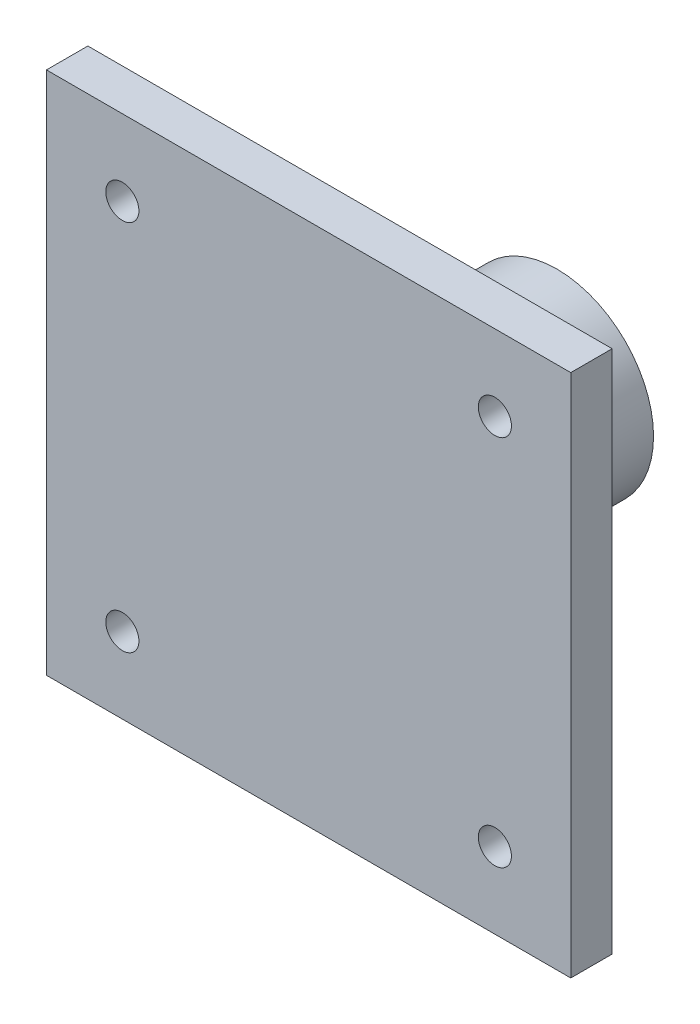
ISO-10303-21;
HEADER;
FILE_DESCRIPTION(('STEP AP214'),'2;1');
FILE_NAME('part.step','',(''),(''),'','','');
FILE_SCHEMA(('AUTOMOTIVE_DESIGN { 1 0 10303 214 1 1 1 1 }'));
ENDSEC;
DATA;
#1=APPLICATION_CONTEXT('core data for automotive mechanical design processes');
#2=APPLICATION_PROTOCOL_DEFINITION('international standard','automotive_design',2000,#1);
#3=PRODUCT_CONTEXT('',#1,'mechanical');
#4=PRODUCT('Part','Part','',(#3));
#5=PRODUCT_RELATED_PRODUCT_CATEGORY('part','',(#4));
#6=PRODUCT_DEFINITION_FORMATION('','',#4);
#7=PRODUCT_DEFINITION_CONTEXT('part definition',#1,'design');
#8=PRODUCT_DEFINITION('design','',#6,#7);
#9=PRODUCT_DEFINITION_SHAPE('','',#8);
#10=(LENGTH_UNIT() NAMED_UNIT(*) SI_UNIT(.MILLI.,.METRE.));
#11=(NAMED_UNIT(*) PLANE_ANGLE_UNIT() SI_UNIT($,.RADIAN.));
#12=(NAMED_UNIT(*) SI_UNIT($,.STERADIAN.) SOLID_ANGLE_UNIT());
#13=UNCERTAINTY_MEASURE_WITH_UNIT(LENGTH_MEASURE(1.E-05),#10,'distance_accuracy_value','');
#14=(GEOMETRIC_REPRESENTATION_CONTEXT(3) GLOBAL_UNCERTAINTY_ASSIGNED_CONTEXT((#13)) GLOBAL_UNIT_ASSIGNED_CONTEXT((#10,
#11,#12)) REPRESENTATION_CONTEXT('',''));
#15=CARTESIAN_POINT('',(0.,0.,0.));
#16=DIRECTION('',(0.,0.,1.));
#17=DIRECTION('',(1.,0.,0.));
#18=AXIS2_PLACEMENT_3D('',#15,#16,#17);
#19=CARTESIAN_POINT('',(0.,0.,3.));
#20=DIRECTION('',(0.,0.,1.));
#21=DIRECTION('',(1.,0.,0.));
#22=AXIS2_PLACEMENT_3D('',#19,#20,#21);
#23=PLANE('',#22);
#24=CARTESIAN_POINT('',(13.5000000000008,-13.4999999999993,3.));
#25=DIRECTION('',(0.,0.,1.));
#26=DIRECTION('',(1.,0.,0.));
#27=AXIS2_PLACEMENT_3D('',#24,#25,#26);
#28=CIRCLE('',#27,1.20000000000109);
#29=CARTESIAN_POINT('',(14.7000000000019,-13.4999999999993,3.));
#30=VERTEX_POINT('',#29);
#31=EDGE_CURVE('E145',#30,#30,#28,.T.);
#32=ORIENTED_EDGE('',*,*,#31,.F.);
#33=EDGE_LOOP('',(#32));
#34=FACE_BOUND('',#33,.T.);
#35=CARTESIAN_POINT('',(-13.5,13.5,3.));
#36=DIRECTION('',(0.,0.,1.));
#37=DIRECTION('',(1.,0.,0.));
#38=AXIS2_PLACEMENT_3D('',#35,#36,#37);
#39=CIRCLE('',#38,1.2);
#40=CARTESIAN_POINT('',(-12.3,13.5,3.));
#41=VERTEX_POINT('',#40);
#42=EDGE_CURVE('E115',#41,#41,#39,.T.);
#43=ORIENTED_EDGE('',*,*,#42,.F.);
#44=EDGE_LOOP('',(#43));
#45=FACE_BOUND('',#44,.T.);
#46=DIRECTION('',(0.,1.,0.));
#47=VECTOR('',#46,1.);
#48=CARTESIAN_POINT('',(19.,19.,3.));
#49=LINE('',#48,#47);
#50=CARTESIAN_POINT('',(19.,-19.,3.));
#51=VERTEX_POINT('',#50);
#52=CARTESIAN_POINT('',(19.,19.,3.));
#53=VERTEX_POINT('',#52);
#54=EDGE_CURVE('E94',#51,#53,#49,.T.);
#55=ORIENTED_EDGE('',*,*,#54,.T.);
#56=DIRECTION('',(-1.,0.,0.));
#57=VECTOR('',#56,1.);
#58=CARTESIAN_POINT('',(-19.,19.,3.));
#59=LINE('',#58,#57);
#60=CARTESIAN_POINT('',(-19.,19.,3.));
#61=VERTEX_POINT('',#60);
#62=EDGE_CURVE('E89',#53,#61,#59,.T.);
#63=ORIENTED_EDGE('',*,*,#62,.T.);
#64=DIRECTION('',(0.,-1.,0.));
#65=VECTOR('',#64,1.);
#66=CARTESIAN_POINT('',(-19.,19.,3.));
#67=LINE('',#66,#65);
#68=CARTESIAN_POINT('',(-19.,-19.,3.));
#69=VERTEX_POINT('',#68);
#70=EDGE_CURVE('E92',#61,#69,#67,.T.);
#71=ORIENTED_EDGE('',*,*,#70,.T.);
#72=DIRECTION('',(1.,0.,0.));
#73=VECTOR('',#72,1.);
#74=CARTESIAN_POINT('',(-19.,-19.,3.));
#75=LINE('',#74,#73);
#76=EDGE_CURVE('E58',#69,#51,#75,.T.);
#77=ORIENTED_EDGE('',*,*,#76,.T.);
#78=EDGE_LOOP('',(#55,#63,#71,#77));
#79=FACE_BOUND('',#78,.T.);
#80=CARTESIAN_POINT('',(13.5,13.5000000000008,3.));
#81=DIRECTION('',(0.,0.,1.));
#82=DIRECTION('',(1.,0.,0.));
#83=AXIS2_PLACEMENT_3D('',#80,#81,#82);
#84=CIRCLE('',#83,1.20000000000079);
#85=CARTESIAN_POINT('',(14.7000000000008,13.5000000000008,3.));
#86=VERTEX_POINT('',#85);
#87=EDGE_CURVE('E137',#86,#86,#84,.T.);
#88=ORIENTED_EDGE('',*,*,#87,.F.);
#89=EDGE_LOOP('',(#88));
#90=FACE_BOUND('',#89,.T.);
#91=CARTESIAN_POINT('',(-13.4999999999993,-13.5,3.));
#92=DIRECTION('',(0.,0.,1.));
#93=DIRECTION('',(1.,0.,0.));
#94=AXIS2_PLACEMENT_3D('',#91,#92,#93);
#95=CIRCLE('',#94,1.20000000000041);
#96=CARTESIAN_POINT('',(-12.2999999999988,-13.5,3.));
#97=VERTEX_POINT('',#96);
#98=EDGE_CURVE('E153',#97,#97,#95,.T.);
#99=ORIENTED_EDGE('',*,*,#98,.F.);
#100=EDGE_LOOP('',(#99));
#101=FACE_BOUND('',#100,.T.);
#102=ADVANCED_FACE('F39',(#34,#45,#79,#90,#101),#23,.T.);
#103=CARTESIAN_POINT('',(0.,0.,0.));
#104=DIRECTION('',(0.,0.,1.));
#105=DIRECTION('',(1.,0.,0.));
#106=AXIS2_PLACEMENT_3D('',#103,#104,#105);
#107=PLANE('',#106);
#108=CARTESIAN_POINT('',(0.,0.,0.));
#109=DIRECTION('',(0.,0.,-1.));
#110=DIRECTION('',(-1.,0.,0.));
#111=AXIS2_PLACEMENT_3D('',#108,#109,#110);
#112=CIRCLE('',#111,7.);
#113=CARTESIAN_POINT('',(-7.,0.,0.));
#114=VERTEX_POINT('',#113);
#115=EDGE_CURVE('E11',#114,#114,#112,.T.);
#116=ORIENTED_EDGE('',*,*,#115,.F.);
#117=EDGE_LOOP('',(#116));
#118=FACE_BOUND('',#117,.T.);
#119=DIRECTION('',(0.,1.,0.));
#120=VECTOR('',#119,1.);
#121=CARTESIAN_POINT('',(19.,19.,0.));
#122=LINE('',#121,#120);
#123=CARTESIAN_POINT('',(19.,-19.,0.));
#124=VERTEX_POINT('',#123);
#125=CARTESIAN_POINT('',(19.,19.,0.));
#126=VERTEX_POINT('',#125);
#127=EDGE_CURVE('E111',#124,#126,#122,.T.);
#128=ORIENTED_EDGE('',*,*,#127,.F.);
#129=DIRECTION('',(1.,0.,0.));
#130=VECTOR('',#129,1.);
#131=CARTESIAN_POINT('',(-19.,-19.,0.));
#132=LINE('',#131,#130);
#133=CARTESIAN_POINT('',(-19.,-19.,0.));
#134=VERTEX_POINT('',#133);
#135=EDGE_CURVE('E81',#134,#124,#132,.T.);
#136=ORIENTED_EDGE('',*,*,#135,.F.);
#137=DIRECTION('',(0.,-1.,0.));
#138=VECTOR('',#137,1.);
#139=CARTESIAN_POINT('',(-19.,19.,0.));
#140=LINE('',#139,#138);
#141=CARTESIAN_POINT('',(-19.,19.,0.));
#142=VERTEX_POINT('',#141);
#143=EDGE_CURVE('E75',#142,#134,#140,.T.);
#144=ORIENTED_EDGE('',*,*,#143,.F.);
#145=DIRECTION('',(-1.,0.,0.));
#146=VECTOR('',#145,1.);
#147=CARTESIAN_POINT('',(-19.,19.,0.));
#148=LINE('',#147,#146);
#149=EDGE_CURVE('E100',#126,#142,#148,.T.);
#150=ORIENTED_EDGE('',*,*,#149,.F.);
#151=EDGE_LOOP('',(#128,#136,#144,#150));
#152=FACE_BOUND('',#151,.T.);
#153=CARTESIAN_POINT('',(-13.5,13.5,0.));
#154=DIRECTION('',(0.,0.,1.));
#155=DIRECTION('',(1.,0.,0.));
#156=AXIS2_PLACEMENT_3D('',#153,#154,#155);
#157=CIRCLE('',#156,1.2);
#158=CARTESIAN_POINT('',(-12.3,13.5,0.));
#159=VERTEX_POINT('',#158);
#160=EDGE_CURVE('E133',#159,#159,#157,.T.);
#161=ORIENTED_EDGE('',*,*,#160,.T.);
#162=EDGE_LOOP('',(#161));
#163=FACE_BOUND('',#162,.T.);
#164=CARTESIAN_POINT('',(13.5,13.5000000000008,0.));
#165=DIRECTION('',(0.,0.,1.));
#166=DIRECTION('',(1.,0.,0.));
#167=AXIS2_PLACEMENT_3D('',#164,#165,#166);
#168=CIRCLE('',#167,1.20000000000079);
#169=CARTESIAN_POINT('',(14.7000000000008,13.5000000000008,0.));
#170=VERTEX_POINT('',#169);
#171=EDGE_CURVE('E141',#170,#170,#168,.T.);
#172=ORIENTED_EDGE('',*,*,#171,.T.);
#173=EDGE_LOOP('',(#172));
#174=FACE_BOUND('',#173,.T.);
#175=CARTESIAN_POINT('',(13.5000000000008,-13.4999999999993,0.));
#176=DIRECTION('',(0.,0.,1.));
#177=DIRECTION('',(1.,0.,0.));
#178=AXIS2_PLACEMENT_3D('',#175,#176,#177);
#179=CIRCLE('',#178,1.20000000000109);
#180=CARTESIAN_POINT('',(14.7000000000019,-13.4999999999993,0.));
#181=VERTEX_POINT('',#180);
#182=EDGE_CURVE('E149',#181,#181,#179,.T.);
#183=ORIENTED_EDGE('',*,*,#182,.T.);
#184=EDGE_LOOP('',(#183));
#185=FACE_BOUND('',#184,.T.);
#186=CARTESIAN_POINT('',(-13.4999999999993,-13.5,0.));
#187=DIRECTION('',(0.,0.,1.));
#188=DIRECTION('',(1.,0.,0.));
#189=AXIS2_PLACEMENT_3D('',#186,#187,#188);
#190=CIRCLE('',#189,1.20000000000041);
#191=CARTESIAN_POINT('',(-12.2999999999988,-13.5,0.));
#192=VERTEX_POINT('',#191);
#193=EDGE_CURVE('E157',#192,#192,#190,.T.);
#194=ORIENTED_EDGE('',*,*,#193,.T.);
#195=EDGE_LOOP('',(#194));
#196=FACE_BOUND('',#195,.T.);
#197=ADVANCED_FACE('F128',(#118,#152,#163,#174,#185,#196),#107,.F.);
#198=CARTESIAN_POINT('',(19.,19.,3.));
#199=DIRECTION('',(-1.,0.,0.));
#200=DIRECTION('',(0.,-1.,0.));
#201=AXIS2_PLACEMENT_3D('',#198,#199,#200);
#202=PLANE('',#201);
#203=ORIENTED_EDGE('',*,*,#127,.T.);
#204=DIRECTION('',(0.,0.,-1.));
#205=VECTOR('',#204,1.);
#206=CARTESIAN_POINT('',(19.,19.,3.));
#207=LINE('',#206,#205);
#208=EDGE_CURVE('E43',#53,#126,#207,.T.);
#209=ORIENTED_EDGE('',*,*,#208,.F.);
#210=ORIENTED_EDGE('',*,*,#54,.F.);
#211=DIRECTION('',(0.,0.,-1.));
#212=VECTOR('',#211,1.);
#213=CARTESIAN_POINT('',(19.,-19.,3.));
#214=LINE('',#213,#212);
#215=EDGE_CURVE('E107',#51,#124,#214,.T.);
#216=ORIENTED_EDGE('',*,*,#215,.T.);
#217=EDGE_LOOP('',(#203,#209,#210,#216));
#218=FACE_BOUND('',#217,.T.);
#219=ADVANCED_FACE('F41',(#218),#202,.F.);
#220=CARTESIAN_POINT('',(-19.,19.,3.));
#221=DIRECTION('',(0.,-1.,0.));
#222=DIRECTION('',(0.,0.,-1.));
#223=AXIS2_PLACEMENT_3D('',#220,#221,#222);
#224=PLANE('',#223);
#225=ORIENTED_EDGE('',*,*,#149,.T.);
#226=DIRECTION('',(0.,0.,-1.));
#227=VECTOR('',#226,1.);
#228=CARTESIAN_POINT('',(-19.,19.,3.));
#229=LINE('',#228,#227);
#230=EDGE_CURVE('E98',#61,#142,#229,.T.);
#231=ORIENTED_EDGE('',*,*,#230,.F.);
#232=ORIENTED_EDGE('',*,*,#62,.F.);
#233=ORIENTED_EDGE('',*,*,#208,.T.);
#234=EDGE_LOOP('',(#225,#231,#232,#233));
#235=FACE_BOUND('',#234,.T.);
#236=ADVANCED_FACE('F99',(#235),#224,.F.);
#237=CARTESIAN_POINT('',(-19.,19.,3.));
#238=DIRECTION('',(1.,0.,0.));
#239=DIRECTION('',(0.,1.,0.));
#240=AXIS2_PLACEMENT_3D('',#237,#238,#239);
#241=PLANE('',#240);
#242=ORIENTED_EDGE('',*,*,#143,.T.);
#243=DIRECTION('',(0.,0.,-1.));
#244=VECTOR('',#243,1.);
#245=CARTESIAN_POINT('',(-19.,-19.,3.));
#246=LINE('',#245,#244);
#247=EDGE_CURVE('E102',#69,#134,#246,.T.);
#248=ORIENTED_EDGE('',*,*,#247,.F.);
#249=ORIENTED_EDGE('',*,*,#70,.F.);
#250=ORIENTED_EDGE('',*,*,#230,.T.);
#251=EDGE_LOOP('',(#242,#248,#249,#250));
#252=FACE_BOUND('',#251,.T.);
#253=ADVANCED_FACE('F103',(#252),#241,.F.);
#254=CARTESIAN_POINT('',(-19.,-19.,3.));
#255=DIRECTION('',(0.,1.,0.));
#256=DIRECTION('',(0.,0.,1.));
#257=AXIS2_PLACEMENT_3D('',#254,#255,#256);
#258=PLANE('',#257);
#259=ORIENTED_EDGE('',*,*,#135,.T.);
#260=ORIENTED_EDGE('',*,*,#215,.F.);
#261=ORIENTED_EDGE('',*,*,#76,.F.);
#262=ORIENTED_EDGE('',*,*,#247,.T.);
#263=EDGE_LOOP('',(#259,#260,#261,#262));
#264=FACE_BOUND('',#263,.T.);
#265=ADVANCED_FACE('F125',(#264),#258,.F.);
#266=CARTESIAN_POINT('',(-13.5,13.5,3.));
#267=DIRECTION('',(0.,0.,-1.));
#268=DIRECTION('',(-1.,0.,0.));
#269=AXIS2_PLACEMENT_3D('',#266,#267,#268);
#270=CYLINDRICAL_SURFACE('',#269,1.2);
#271=ORIENTED_EDGE('',*,*,#42,.T.);
#272=EDGE_LOOP('',(#271));
#273=FACE_BOUND('',#272,.T.);
#274=ORIENTED_EDGE('',*,*,#160,.F.);
#275=EDGE_LOOP('',(#274));
#276=FACE_BOUND('',#275,.T.);
#277=ADVANCED_FACE('F190',(#273,#276),#270,.F.);
#278=CARTESIAN_POINT('',(13.5,13.5000000000008,3.));
#279=DIRECTION('',(0.,0.,-1.));
#280=DIRECTION('',(-1.,0.,0.));
#281=AXIS2_PLACEMENT_3D('',#278,#279,#280);
#282=CYLINDRICAL_SURFACE('',#281,1.20000000000079);
#283=ORIENTED_EDGE('',*,*,#87,.T.);
#284=EDGE_LOOP('',(#283));
#285=FACE_BOUND('',#284,.T.);
#286=ORIENTED_EDGE('',*,*,#171,.F.);
#287=EDGE_LOOP('',(#286));
#288=FACE_BOUND('',#287,.T.);
#289=ADVANCED_FACE('F211',(#285,#288),#282,.F.);
#290=CARTESIAN_POINT('',(13.5000000000008,-13.4999999999993,3.));
#291=DIRECTION('',(0.,0.,-1.));
#292=DIRECTION('',(-1.,0.,0.));
#293=AXIS2_PLACEMENT_3D('',#290,#291,#292);
#294=CYLINDRICAL_SURFACE('',#293,1.20000000000109);
#295=ORIENTED_EDGE('',*,*,#31,.T.);
#296=EDGE_LOOP('',(#295));
#297=FACE_BOUND('',#296,.T.);
#298=ORIENTED_EDGE('',*,*,#182,.F.);
#299=EDGE_LOOP('',(#298));
#300=FACE_BOUND('',#299,.T.);
#301=ADVANCED_FACE('F218',(#297,#300),#294,.F.);
#302=CARTESIAN_POINT('',(-13.4999999999993,-13.5,3.));
#303=DIRECTION('',(0.,0.,-1.));
#304=DIRECTION('',(-1.,0.,0.));
#305=AXIS2_PLACEMENT_3D('',#302,#303,#304);
#306=CYLINDRICAL_SURFACE('',#305,1.20000000000041);
#307=ORIENTED_EDGE('',*,*,#98,.T.);
#308=EDGE_LOOP('',(#307));
#309=FACE_BOUND('',#308,.T.);
#310=ORIENTED_EDGE('',*,*,#193,.F.);
#311=EDGE_LOOP('',(#310));
#312=FACE_BOUND('',#311,.T.);
#313=ADVANCED_FACE('F174',(#309,#312),#306,.F.);
#314=CARTESIAN_POINT('',(0.,0.,-15.));
#315=DIRECTION('',(0.,0.,1.));
#316=DIRECTION('',(1.,0.,0.));
#317=AXIS2_PLACEMENT_3D('',#314,#315,#316);
#318=CYLINDRICAL_SURFACE('',#317,7.);
#319=CARTESIAN_POINT('',(0.,0.,-15.));
#320=DIRECTION('',(0.,0.,-1.));
#321=DIRECTION('',(-1.,0.,0.));
#322=AXIS2_PLACEMENT_3D('',#319,#320,#321);
#323=CIRCLE('',#322,7.);
#324=CARTESIAN_POINT('',(-7.,0.,-15.));
#325=VERTEX_POINT('',#324);
#326=EDGE_CURVE('E161',#325,#325,#323,.T.);
#327=ORIENTED_EDGE('',*,*,#326,.F.);
#328=EDGE_LOOP('',(#327));
#329=FACE_BOUND('',#328,.T.);
#330=ORIENTED_EDGE('',*,*,#115,.T.);
#331=EDGE_LOOP('',(#330));
#332=FACE_BOUND('',#331,.T.);
#333=ADVANCED_FACE('F171',(#329,#332),#318,.T.);
#334=CARTESIAN_POINT('',(0.,0.,-15.));
#335=DIRECTION('',(0.,0.,-1.));
#336=DIRECTION('',(-1.,0.,0.));
#337=AXIS2_PLACEMENT_3D('',#334,#335,#336);
#338=PLANE('',#337);
#339=ORIENTED_EDGE('',*,*,#326,.T.);
#340=EDGE_LOOP('',(#339));
#341=FACE_BOUND('',#340,.T.);
#342=ADVANCED_FACE('F169',(#341),#338,.T.);
#343=CLOSED_SHELL('',(#102,#197,#219,#236,#253,#265,#277,#289,#301,#313,#333,#342));
#344=MANIFOLD_SOLID_BREP('B2',#343);
#345=ADVANCED_BREP_SHAPE_REPRESENTATION('',(#18,#344),#14);
#346=SHAPE_DEFINITION_REPRESENTATION(#9,#345);
ENDSEC;
END-ISO-10303-21;
